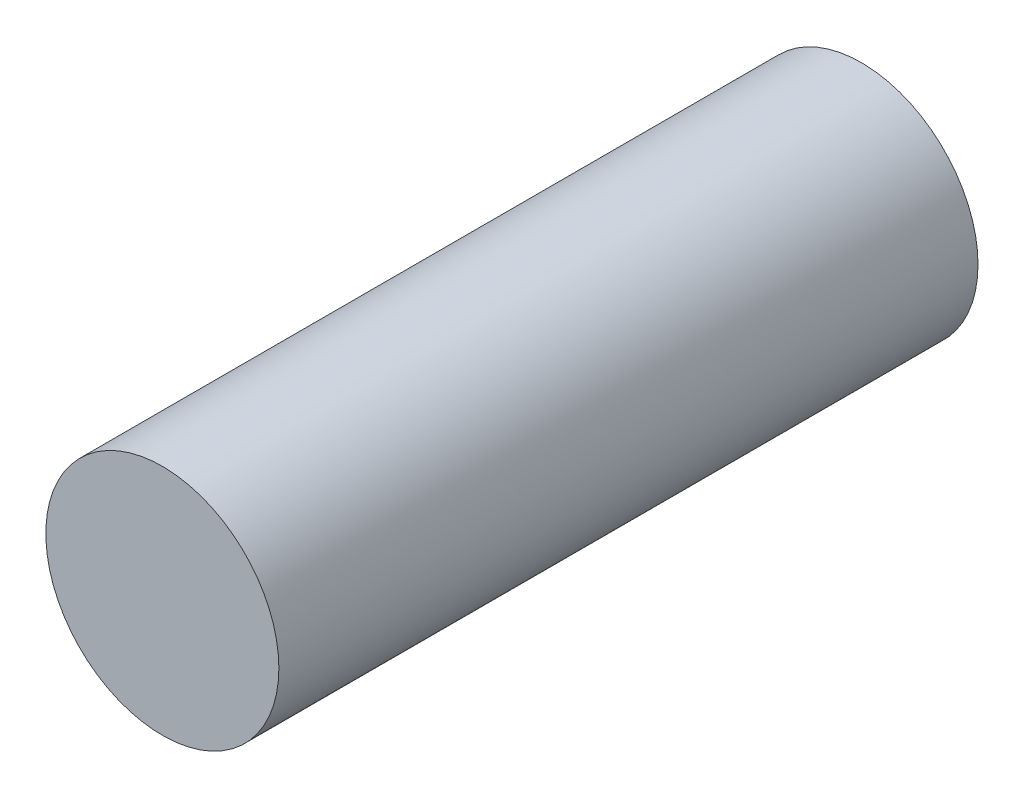
ISO-10303-21;
HEADER;
FILE_DESCRIPTION(('STEP AP214'),'2;1');
FILE_NAME('part.step','',(''),(''),'','','');
FILE_SCHEMA(('AUTOMOTIVE_DESIGN { 1 0 10303 214 1 1 1 1 }'));
ENDSEC;
DATA;
#1=APPLICATION_CONTEXT('core data for automotive mechanical design processes');
#2=APPLICATION_PROTOCOL_DEFINITION('international standard','automotive_design',2000,#1);
#3=PRODUCT_CONTEXT('',#1,'mechanical');
#4=PRODUCT('Part','Part','',(#3));
#5=PRODUCT_RELATED_PRODUCT_CATEGORY('part','',(#4));
#6=PRODUCT_DEFINITION_FORMATION('','',#4);
#7=PRODUCT_DEFINITION_CONTEXT('part definition',#1,'design');
#8=PRODUCT_DEFINITION('design','',#6,#7);
#9=PRODUCT_DEFINITION_SHAPE('','',#8);
#10=(LENGTH_UNIT() NAMED_UNIT(*) SI_UNIT(.MILLI.,.METRE.));
#11=(NAMED_UNIT(*) PLANE_ANGLE_UNIT() SI_UNIT($,.RADIAN.));
#12=(NAMED_UNIT(*) SI_UNIT($,.STERADIAN.) SOLID_ANGLE_UNIT());
#13=UNCERTAINTY_MEASURE_WITH_UNIT(LENGTH_MEASURE(1.E-05),#10,'distance_accuracy_value','');
#14=(GEOMETRIC_REPRESENTATION_CONTEXT(3) GLOBAL_UNCERTAINTY_ASSIGNED_CONTEXT((#13)) GLOBAL_UNIT_ASSIGNED_CONTEXT((#10,
#11,#12)) REPRESENTATION_CONTEXT('',''));
#15=CARTESIAN_POINT('',(0.,0.,0.));
#16=DIRECTION('',(0.,0.,1.));
#17=DIRECTION('',(1.,0.,0.));
#18=AXIS2_PLACEMENT_3D('',#15,#16,#17);
#19=CARTESIAN_POINT('',(0.,0.,76.2));
#20=DIRECTION('',(0.,0.,-1.));
#21=DIRECTION('',(-1.,0.,0.));
#22=AXIS2_PLACEMENT_3D('',#19,#20,#21);
#23=CYLINDRICAL_SURFACE('',#22,12.7);
#24=CARTESIAN_POINT('',(0.,0.,76.2));
#25=DIRECTION('',(0.,0.,1.));
#26=DIRECTION('',(1.,0.,0.));
#27=AXIS2_PLACEMENT_3D('',#24,#25,#26);
#28=CIRCLE('',#27,12.7);
#29=CARTESIAN_POINT('',(12.7,0.,76.2));
#30=VERTEX_POINT('',#29);
#31=EDGE_CURVE('E10',#30,#30,#28,.T.);
#32=ORIENTED_EDGE('',*,*,#31,.F.);
#33=EDGE_LOOP('',(#32));
#34=FACE_BOUND('',#33,.T.);
#35=CARTESIAN_POINT('',(0.,0.,0.));
#36=DIRECTION('',(0.,0.,1.));
#37=DIRECTION('',(1.,0.,0.));
#38=AXIS2_PLACEMENT_3D('',#35,#36,#37);
#39=CIRCLE('',#38,12.7);
#40=CARTESIAN_POINT('',(12.7,0.,0.));
#41=VERTEX_POINT('',#40);
#42=EDGE_CURVE('E18',#41,#41,#39,.T.);
#43=ORIENTED_EDGE('',*,*,#42,.T.);
#44=EDGE_LOOP('',(#43));
#45=FACE_BOUND('',#44,.T.);
#46=ADVANCED_FACE('F15',(#34,#45),#23,.T.);
#47=CARTESIAN_POINT('',(0.,0.,76.2));
#48=DIRECTION('',(0.,0.,1.));
#49=DIRECTION('',(1.,0.,0.));
#50=AXIS2_PLACEMENT_3D('',#47,#48,#49);
#51=PLANE('',#50);
#52=ORIENTED_EDGE('',*,*,#31,.T.);
#53=EDGE_LOOP('',(#52));
#54=FACE_BOUND('',#53,.T.);
#55=ADVANCED_FACE('F30',(#54),#51,.T.);
#56=CARTESIAN_POINT('',(0.,0.,0.));
#57=DIRECTION('',(0.,0.,1.));
#58=DIRECTION('',(1.,0.,0.));
#59=AXIS2_PLACEMENT_3D('',#56,#57,#58);
#60=PLANE('',#59);
#61=ORIENTED_EDGE('',*,*,#42,.F.);
#62=EDGE_LOOP('',(#61));
#63=FACE_BOUND('',#62,.T.);
#64=ADVANCED_FACE('F28',(#63),#60,.F.);
#65=CLOSED_SHELL('',(#46,#55,#64));
#66=MANIFOLD_SOLID_BREP('B1',#65);
#67=ADVANCED_BREP_SHAPE_REPRESENTATION('',(#18,#66),#14);
#68=SHAPE_DEFINITION_REPRESENTATION(#9,#67);
ENDSEC;
END-ISO-10303-21;
